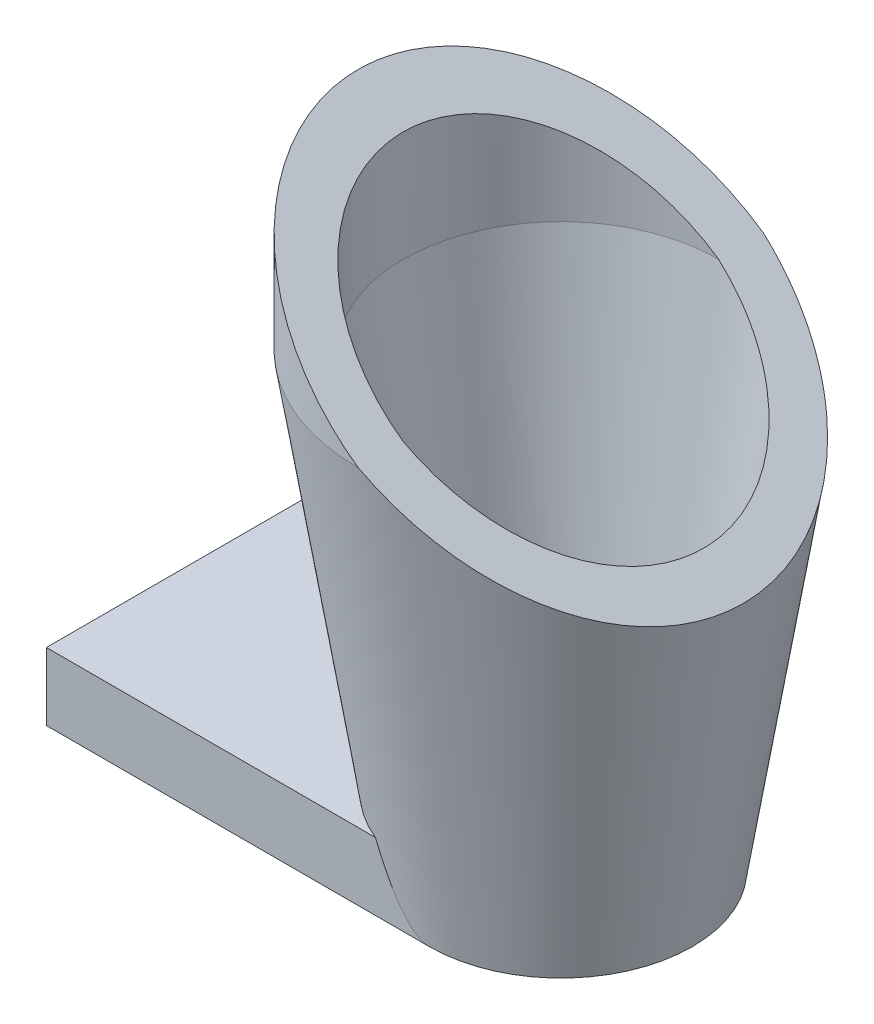
ISO-10303-21;
HEADER;
FILE_DESCRIPTION(('STEP AP214'),'2;1');
FILE_NAME('part.step','',(''),(''),'','','');
FILE_SCHEMA(('AUTOMOTIVE_DESIGN { 1 0 10303 214 1 1 1 1 }'));
ENDSEC;
DATA;
#1=APPLICATION_CONTEXT('core data for automotive mechanical design processes');
#2=APPLICATION_PROTOCOL_DEFINITION('international standard','automotive_design',2000,#1);
#3=PRODUCT_CONTEXT('',#1,'mechanical');
#4=PRODUCT('Part','Part','',(#3));
#5=PRODUCT_RELATED_PRODUCT_CATEGORY('part','',(#4));
#6=PRODUCT_DEFINITION_FORMATION('','',#4);
#7=PRODUCT_DEFINITION_CONTEXT('part definition',#1,'design');
#8=PRODUCT_DEFINITION('design','',#6,#7);
#9=PRODUCT_DEFINITION_SHAPE('','',#8);
#10=(LENGTH_UNIT() NAMED_UNIT(*) SI_UNIT(.MILLI.,.METRE.));
#11=(NAMED_UNIT(*) PLANE_ANGLE_UNIT() SI_UNIT($,.RADIAN.));
#12=(NAMED_UNIT(*) SI_UNIT($,.STERADIAN.) SOLID_ANGLE_UNIT());
#13=UNCERTAINTY_MEASURE_WITH_UNIT(LENGTH_MEASURE(1.E-05),#10,'distance_accuracy_value','');
#14=(GEOMETRIC_REPRESENTATION_CONTEXT(3) GLOBAL_UNCERTAINTY_ASSIGNED_CONTEXT((#13)) GLOBAL_UNIT_ASSIGNED_CONTEXT((#10,
#11,#12)) REPRESENTATION_CONTEXT('',''));
#15=CARTESIAN_POINT('',(0.,0.,0.));
#16=DIRECTION('',(0.,0.,1.));
#17=DIRECTION('',(1.,0.,0.));
#18=AXIS2_PLACEMENT_3D('',#15,#16,#17);
#19=CARTESIAN_POINT('',(0.,0.,0.));
#20=DIRECTION('',(0.573576436351047,0.819152044288991,0.));
#21=DIRECTION('',(-0.819152044288991,0.573576436351047,0.));
#22=AXIS2_PLACEMENT_3D('',#19,#20,#21);
#23=PLANE('',#22);
#24=CARTESIAN_POINT('',(-1.01054677785715,0.707592471569111,0.));
#25=DIRECTION('',(0.573576436351047,0.819152044288991,0.));
#26=DIRECTION('',(-0.819152044288991,0.573576436351047,0.));
#27=AXIS2_PLACEMENT_3D('',#24,#25,#26);
#28=ELLIPSE('',#27,11.1237855061406,9.05586245137844);
#29=CARTESIAN_POINT('',(0.,0.,-9.));
#30=VERTEX_POINT('',#29);
#31=CARTESIAN_POINT('',(0.,0.,9.));
#32=VERTEX_POINT('',#31);
#33=EDGE_CURVE('E50',#30,#32,#28,.F.);
#34=ORIENTED_EDGE('',*,*,#33,.F.);
#35=CARTESIAN_POINT('',(0.,0.,0.));
#36=DIRECTION('',(0.573576436351047,0.819152044288991,0.));
#37=DIRECTION('',(0.819152044288991,-0.573576436351047,0.));
#38=AXIS2_PLACEMENT_3D('',#35,#36,#37);
#39=ELLIPSE('',#38,10.9869712988531,9.);
#40=EDGE_CURVE('E186',#30,#32,#39,.T.);
#41=ORIENTED_EDGE('',*,*,#40,.T.);
#42=EDGE_LOOP('',(#34,#41));
#43=FACE_BOUND('',#42,.T.);
#44=CARTESIAN_POINT('',(-0.74341897005252,0.520547566878874,0.));
#45=DIRECTION('',(0.573576436351047,0.819152044288991,0.));
#46=DIRECTION('',(-0.819152044288991,0.573576436351047,0.));
#47=AXIS2_PLACEMENT_3D('',#44,#45,#46);
#48=ELLIPSE('',#47,8.6407428076133,7.0389327987432);
#49=CARTESIAN_POINT('',(0.,0.,7.));
#50=VERTEX_POINT('',#49);
#51=CARTESIAN_POINT('',(0.,0.,-7.));
#52=VERTEX_POINT('',#51);
#53=EDGE_CURVE('E180',#50,#52,#48,.T.);
#54=ORIENTED_EDGE('',*,*,#53,.F.);
#55=CARTESIAN_POINT('',(0.,0.,0.));
#56=DIRECTION('',(0.573576436351047,0.819152044288991,0.));
#57=DIRECTION('',(0.819152044288991,-0.573576436351047,0.));
#58=AXIS2_PLACEMENT_3D('',#55,#56,#57);
#59=ELLIPSE('',#58,8.5454221213302,7.);
#60=EDGE_CURVE('E171',#50,#52,#59,.F.);
#61=ORIENTED_EDGE('',*,*,#60,.T.);
#62=EDGE_LOOP('',(#54,#61));
#63=FACE_BOUND('',#62,.T.);
#64=ADVANCED_FACE('F42',(#43,#63),#23,.T.);
#65=CARTESIAN_POINT('',(0.,30.,0.));
#66=DIRECTION('',(0.,-1.,0.));
#67=DIRECTION('',(0.,0.,-1.));
#68=AXIS2_PLACEMENT_3D('',#65,#66,#67);
#69=CYLINDRICAL_SURFACE('',#68,9.);
#70=ORIENTED_EDGE('',*,*,#40,.F.);
#71=CARTESIAN_POINT('',(0.,0.,0.));
#72=DIRECTION('',(0.,1.,0.));
#73=DIRECTION('',(0.,0.,1.));
#74=AXIS2_PLACEMENT_3D('',#71,#72,#73);
#75=CIRCLE('',#74,9.);
#76=EDGE_CURVE('E190',#30,#32,#75,.T.);
#77=ORIENTED_EDGE('',*,*,#76,.T.);
#78=EDGE_LOOP('',(#70,#77));
#79=FACE_BOUND('',#78,.T.);
#80=ADVANCED_FACE('F44',(#79),#69,.T.);
#81=CARTESIAN_POINT('',(0.,0.,0.));
#82=DIRECTION('',(0.,1.,0.));
#83=DIRECTION('',(0.,0.,1.));
#84=AXIS2_PLACEMENT_3D('',#81,#82,#83);
#85=CONICAL_SURFACE('',#84,9.,0.15707963267949);
#86=CARTESIAN_POINT('',(5.19434586932446,-7.51296701949486,5.83231119350927));
#87=CARTESIAN_POINT('',(5.12920988199603,-7.78647127982895,5.83231119350927));
#88=CARTESIAN_POINT('',(5.06343410501989,-8.05982282079686,5.83231119350927));
#89=CARTESIAN_POINT('',(4.93043372323485,-8.6061773447744,5.83231119350927));
#90=CARTESIAN_POINT('',(4.86320909694845,-8.87918032255336,5.83231119350927));
#91=CARTESIAN_POINT('',(4.6590633420928,-9.69778061581938,5.83231119350927));
#92=CARTESIAN_POINT('',(4.51971571861351,-10.2427776797327,5.83231119350927));
#93=CARTESIAN_POINT('',(4.23230979586455,-11.3318574299918,5.83231119350927));
#94=CARTESIAN_POINT('',(4.08423164091301,-11.8759348906396,5.83231119350927));
#95=CARTESIAN_POINT('',(3.77679250254619,-12.9608464004582,5.83231119350927));
#96=CARTESIAN_POINT('',(3.61743332847668,-13.5016809547284,5.83231119350927));
#97=CARTESIAN_POINT('',(3.39430202929781,-14.218858707378,5.83231119350927));
#98=CARTESIAN_POINT('',(3.33775425104193,-14.3974506865559,5.83231119350927));
#99=CARTESIAN_POINT('',(3.22256578347137,-14.7539596783538,5.83231119350927));
#100=CARTESIAN_POINT('',(3.16392506355995,-14.931876681064,5.83231119350927));
#101=CARTESIAN_POINT('',(2.98446978337873,-15.4642700706301,5.83231119350927));
#102=CARTESIAN_POINT('',(2.86006951313184,-15.8175599335519,5.83231119350927));
#103=CARTESIAN_POINT('',(2.6304495334737,-16.4319420760984,5.83231119350927));
#104=CARTESIAN_POINT('',(2.52815039584054,-16.6941193415446,5.83231119350927));
#105=CARTESIAN_POINT('',(2.31320872601671,-17.2144072699542,5.83231119350927));
#106=CARTESIAN_POINT('',(2.2005609117001,-17.4725157765312,5.83231119350927));
#107=CARTESIAN_POINT('',(1.97829671895806,-17.9440865220114,5.83231119350927));
#108=CARTESIAN_POINT('',(1.87071561684824,-18.1584854831473,5.83231119350927));
#109=CARTESIAN_POINT('',(1.69751664761931,-18.4735531637749,5.83231119350927));
#110=CARTESIAN_POINT('',(1.63782568356414,-18.577466941714,5.83231119350927));
#111=CARTESIAN_POINT('',(1.51347044509526,-18.7822565053364,5.83231119350927));
#112=CARTESIAN_POINT('',(1.44880803051784,-18.8831334076607,5.83231119350927));
#113=CARTESIAN_POINT('',(1.3094432995376,-19.0858835005155,5.83231119350927));
#114=CARTESIAN_POINT('',(1.23438733053995,-19.1875161602096,5.83231119350927));
#115=CARTESIAN_POINT('',(1.07476989279456,-19.3832604610137,5.83231119350927));
#116=CARTESIAN_POINT('',(0.99021131931211,-19.477374378072,5.83231119350927));
#117=CARTESIAN_POINT('',(0.837140385191678,-19.6246127192372,5.83231119350927));
#118=CARTESIAN_POINT('',(0.772063614285766,-19.6812609285817,5.83231119350927));
#119=CARTESIAN_POINT('',(0.634685293743661,-19.7850978240107,5.83231119350927));
#120=CARTESIAN_POINT('',(0.562399628354826,-19.8323066478007,5.83231119350927));
#121=CARTESIAN_POINT('',(0.434177811989067,-19.8995527315546,5.83231119350927));
#122=CARTESIAN_POINT('',(0.380302420160602,-19.9234612956882,5.83231119350927));
#123=CARTESIAN_POINT('',(0.269424926631262,-19.9623790634055,5.83231119350927));
#124=CARTESIAN_POINT('',(0.212427958741745,-19.9774024264526,5.83231119350927));
#125=CARTESIAN_POINT('',(0.0960666381006544,-19.9968458852791,5.83231119350927));
#126=CARTESIAN_POINT('',(0.0366857474174538,-20.0011705590198,5.83231119350927));
#127=CARTESIAN_POINT('',(-0.0818055205394074,-19.998278482631,5.83231119350927));
#128=CARTESIAN_POINT('',(-0.140915811276729,-19.991058268251,5.83231119350927));
#129=CARTESIAN_POINT('',(-0.250357494400871,-19.9675304347788,5.83231119350927));
#130=CARTESIAN_POINT('',(-0.300935326669671,-19.9523197880275,5.83231119350927));
#131=CARTESIAN_POINT('',(-0.399453626870303,-19.9150402248853,5.83231119350927));
#132=CARTESIAN_POINT('',(-0.447393207148968,-19.8929690166291,5.83231119350927));
#133=CARTESIAN_POINT('',(-0.57828174996616,-19.8232567031038,5.83231119350927));
#134=CARTESIAN_POINT('',(-0.657912585044697,-19.7694383361895,5.83231119350927));
#135=CARTESIAN_POINT('',(-0.808553807466479,-19.650832640402,5.83231119350927));
#136=CARTESIAN_POINT('',(-0.879529090725282,-19.5860030394786,5.83231119350927));
#137=CARTESIAN_POINT('',(-1.04256192316421,-19.4210536634282,5.83231119350927));
#138=CARTESIAN_POINT('',(-1.13108054828879,-19.3174853313675,5.83231119350927));
#139=CARTESIAN_POINT('',(-1.29809802422332,-19.1024612183323,5.83231119350927));
#140=CARTESIAN_POINT('',(-1.37657319799393,-18.9909877280796,5.83231119350927));
#141=CARTESIAN_POINT('',(-1.52645236967372,-18.7624695807171,5.83231119350927));
#142=CARTESIAN_POINT('',(-1.59781085280664,-18.6453953710672,5.83231119350927));
#143=CARTESIAN_POINT('',(-1.73463349509898,-18.4080762362964,5.83231119350927));
#144=CARTESIAN_POINT('',(-1.80010444178487,-18.28783517447,5.83231119350927));
#145=CARTESIAN_POINT('',(-1.93328356873754,-18.0319423172552,5.83231119350927));
#146=CARTESIAN_POINT('',(-2.00047562001362,-17.8960234328597,5.83231119350927));
#147=CARTESIAN_POINT('',(-2.13044004952181,-17.6220802484604,5.83231119350927));
#148=CARTESIAN_POINT('',(-2.19321173762589,-17.4840556237731,5.83231119350927));
#149=CARTESIAN_POINT('',(-2.37625539251654,-17.0674817129787,5.83231119350927));
#150=CARTESIAN_POINT('',(-2.49117884048847,-16.7865859891474,5.83231119350927));
#151=CARTESIAN_POINT('',(-2.71135189076989,-16.2202837703667,5.83231119350927));
#152=CARTESIAN_POINT('',(-2.81657631675924,-15.9348676714349,5.83231119350927));
#153=CARTESIAN_POINT('',(-3.01953013430117,-15.3615018697021,5.83231119350927));
#154=CARTESIAN_POINT('',(-3.11726200034593,-15.0735530386881,5.83231119350927));
#155=CARTESIAN_POINT('',(-3.30696410685768,-14.4957348186245,5.83231119350927));
#156=CARTESIAN_POINT('',(-3.39893360625622,-14.2058651878295,5.83231119350927));
#157=CARTESIAN_POINT('',(-3.57824904793539,-13.6246801864875,5.83231119350927));
#158=CARTESIAN_POINT('',(-3.66559461868936,-13.3333647018185,5.83231119350927));
#159=CARTESIAN_POINT('',(-3.92176808529967,-12.4585379078912,5.83231119350927));
#160=CARTESIAN_POINT('',(-4.08497835802908,-11.8733810418626,5.83231119350927));
#161=CARTESIAN_POINT('',(-4.32737054937651,-10.972968829312,5.83231119350927));
#162=CARTESIAN_POINT('',(-4.41034029088836,-10.6587154710423,5.83231119350927));
#163=CARTESIAN_POINT('',(-4.57368510312026,-10.0294330142763,5.83231119350927));
#164=CARTESIAN_POINT('',(-4.65405939372604,-9.71440371262004,5.83231119350927));
#165=CARTESIAN_POINT('',(-4.81220606411192,-9.08519262629502,5.83231119350927));
#166=CARTESIAN_POINT('',(-4.88998847463864,-8.77101335423387,5.83231119350927));
#167=CARTESIAN_POINT('',(-5.0435752458452,-8.14227776836471,5.83231119350927));
#168=CARTESIAN_POINT('',(-5.11938023060825,-7.82772160710392,5.83231119350927));
#169=CARTESIAN_POINT('',(-5.19434586932446,-7.51296701949486,5.83231119350927));
#170=B_SPLINE_CURVE_WITH_KNOTS('',3,(#86,#87,#88,#89,#90,#91,#92,#93,#94,#95,#96,#97,#98,#99,
#100,#101,#102,#103,#104,#105,#106,#107,#108,#109,#110,#111,#112,#113,#114,#115,#116,#117,#118,
#119,#120,#121,#122,#123,#124,#125,#126,#127,#128,#129,#130,#131,#132,#133,#134,#135,#136,#137,
#138,#139,#140,#141,#142,#143,#144,#145,#146,#147,#148,#149,#150,#151,#152,#153,#154,#155,#156,
#157,#158,#159,#160,#161,#162,#163,#164,#165,#166,#167,#168,#169),.UNSPECIFIED.,.F.,.F.,(4,2,2,
2,2,2,2,2,2,2,2,2,2,2,2,2,2,2,2,2,2,2,2,2,2,2,2,2,2,2,2,2,2,2,2,2,2,2,2,2,2,4),(0.,
0.8434584679724,1.6869294478493,3.3744621133143,5.06599299062163,6.75725317784033,
7.31923313899781,7.88122131911607,9.0046608247589,9.84879540209149,10.6933632584468,
11.4124765188797,11.7718880433731,12.1311657590094,12.5098507622534,12.8884206985039,
13.1467320621161,13.4044863300187,13.5807108060798,13.756653688646,13.9341602448174,
14.1117200750091,14.2695822224676,14.4274971627364,14.7141424518004,15.0019141277174,
15.4095990126537,15.8182279566619,16.2293220624831,16.6399359884974,17.0946920551472,
17.5495189637778,18.4596876729121,19.3721560803414,20.2843218261069,21.1966046410605,
22.1089606458424,23.9312624615067,24.9063224961421,25.8816729269457,26.8526603528826,
27.8233375300438),.UNSPECIFIED.);
#171=CARTESIAN_POINT('',(0.,-20.,5.83231119350927));
#172=VERTEX_POINT('',#171);
#173=CARTESIAN_POINT('',(-2.4017191225302,-17.,5.83231119350927));
#174=VERTEX_POINT('',#173);
#175=EDGE_CURVE('E97',#172,#174,#170,.T.);
#176=ORIENTED_EDGE('',*,*,#175,.F.);
#177=CARTESIAN_POINT('',(0.,-20.,0.));
#178=DIRECTION('',(0.,1.,0.));
#179=DIRECTION('',(0.,0.,1.));
#180=AXIS2_PLACEMENT_3D('',#177,#178,#179);
#181=CIRCLE('',#180,5.83231119350927);
#182=CARTESIAN_POINT('',(0.,-20.,-5.83231119350927));
#183=VERTEX_POINT('',#182);
#184=EDGE_CURVE('E193',#172,#183,#181,.T.);
#185=ORIENTED_EDGE('',*,*,#184,.T.);
#186=CARTESIAN_POINT('',(5.19434586932446,-7.51296701949486,-5.83231119350927));
#187=CARTESIAN_POINT('',(5.12920988199603,-7.78647127982895,-5.83231119350927));
#188=CARTESIAN_POINT('',(5.06343410501989,-8.05982282079685,-5.83231119350927));
#189=CARTESIAN_POINT('',(4.93043372323485,-8.60617734477439,-5.83231119350927));
#190=CARTESIAN_POINT('',(4.86320909694845,-8.87918032255336,-5.83231119350927));
#191=CARTESIAN_POINT('',(4.6590633420928,-9.69778061581937,-5.83231119350927));
#192=CARTESIAN_POINT('',(4.51971571861351,-10.2427776797327,-5.83231119350927));
#193=CARTESIAN_POINT('',(4.23230979586455,-11.3318574299918,-5.83231119350927));
#194=CARTESIAN_POINT('',(4.08423164091301,-11.8759348906396,-5.83231119350927));
#195=CARTESIAN_POINT('',(3.77679250254619,-12.9608464004582,-5.83231119350927));
#196=CARTESIAN_POINT('',(3.61743332847668,-13.5016809547284,-5.83231119350927));
#197=CARTESIAN_POINT('',(3.39430202929781,-14.218858707378,-5.83231119350927));
#198=CARTESIAN_POINT('',(3.33775425104192,-14.3974506865559,-5.83231119350927));
#199=CARTESIAN_POINT('',(3.22256578347137,-14.7539596783538,-5.83231119350927));
#200=CARTESIAN_POINT('',(3.16392506355995,-14.931876681064,-5.83231119350927));
#201=CARTESIAN_POINT('',(2.98446978337873,-15.4642700706301,-5.83231119350927));
#202=CARTESIAN_POINT('',(2.86006951313184,-15.8175599335519,-5.83231119350927));
#203=CARTESIAN_POINT('',(2.63044953347369,-16.4319420760984,-5.83231119350927));
#204=CARTESIAN_POINT('',(2.52815039584053,-16.6941193415446,-5.83231119350927));
#205=CARTESIAN_POINT('',(2.31320872601669,-17.2144072699542,-5.83231119350927));
#206=CARTESIAN_POINT('',(2.20056091170008,-17.4725157765312,-5.83231119350927));
#207=CARTESIAN_POINT('',(1.97829671895803,-17.9440865220114,-5.83231119350927));
#208=CARTESIAN_POINT('',(1.87071561684819,-18.1584854831474,-5.83231119350927));
#209=CARTESIAN_POINT('',(1.69751664761925,-18.4735531637751,-5.83231119350927));
#210=CARTESIAN_POINT('',(1.63782568356407,-18.5774669417141,-5.83231119350927));
#211=CARTESIAN_POINT('',(1.51347044509517,-18.7822565053366,-5.83231119350927));
#212=CARTESIAN_POINT('',(1.44880803051775,-18.8831334076608,-5.83231119350927));
#213=CARTESIAN_POINT('',(1.30944329953751,-19.0858835005157,-5.83231119350927));
#214=CARTESIAN_POINT('',(1.23438733053989,-19.1875161602097,-5.83231119350927));
#215=CARTESIAN_POINT('',(1.07476989279455,-19.3832604610137,-5.83231119350927));
#216=CARTESIAN_POINT('',(0.990211319312122,-19.477374378072,-5.83231119350927));
#217=CARTESIAN_POINT('',(0.837140385191708,-19.6246127192371,-5.83231119350927));
#218=CARTESIAN_POINT('',(0.772063614285782,-19.6812609285817,-5.83231119350927));
#219=CARTESIAN_POINT('',(0.634685293743645,-19.7850978240107,-5.83231119350927));
#220=CARTESIAN_POINT('',(0.562399628354792,-19.8323066478008,-5.83231119350927));
#221=CARTESIAN_POINT('',(0.434177811989017,-19.8995527315547,-5.83231119350927));
#222=CARTESIAN_POINT('',(0.380302420160556,-19.9234612956882,-5.83231119350927));
#223=CARTESIAN_POINT('',(0.269424926631224,-19.9623790634055,-5.83231119350927));
#224=CARTESIAN_POINT('',(0.21242795874171,-19.9774024264526,-5.83231119350927));
#225=CARTESIAN_POINT('',(0.0960666381006271,-19.9968458852791,-5.83231119350927));
#226=CARTESIAN_POINT('',(0.0366857474174307,-20.0011705590198,-5.83231119350927));
#227=CARTESIAN_POINT('',(-0.0818055205394211,-19.998278482631,-5.83231119350927));
#228=CARTESIAN_POINT('',(-0.140915811276737,-19.991058268251,-5.83231119350927));
#229=CARTESIAN_POINT('',(-0.250357494400875,-19.9675304347788,-5.83231119350927));
#230=CARTESIAN_POINT('',(-0.300935326669676,-19.9523197880275,-5.83231119350927));
#231=CARTESIAN_POINT('',(-0.399453626870307,-19.9150402248853,-5.83231119350927));
#232=CARTESIAN_POINT('',(-0.447393207148971,-19.8929690166291,-5.83231119350927));
#233=CARTESIAN_POINT('',(-0.578281749966161,-19.8232567031038,-5.83231119350927));
#234=CARTESIAN_POINT('',(-0.657912585044698,-19.7694383361895,-5.83231119350927));
#235=CARTESIAN_POINT('',(-0.808553807466481,-19.650832640402,-5.83231119350927));
#236=CARTESIAN_POINT('',(-0.879529090725285,-19.5860030394785,-5.83231119350927));
#237=CARTESIAN_POINT('',(-1.04256192316421,-19.4210536634281,-5.83231119350927));
#238=CARTESIAN_POINT('',(-1.1310805482888,-19.3174853313675,-5.83231119350927));
#239=CARTESIAN_POINT('',(-1.29809802422333,-19.1024612183323,-5.83231119350927));
#240=CARTESIAN_POINT('',(-1.37657319799394,-18.9909877280796,-5.83231119350927));
#241=CARTESIAN_POINT('',(-1.52645236967373,-18.7624695807171,-5.83231119350927));
#242=CARTESIAN_POINT('',(-1.59781085280665,-18.6453953710672,-5.83231119350927));
#243=CARTESIAN_POINT('',(-1.73463349509899,-18.4080762362964,-5.83231119350927));
#244=CARTESIAN_POINT('',(-1.80010444178488,-18.28783517447,-5.83231119350927));
#245=CARTESIAN_POINT('',(-1.93328356873755,-18.0319423172552,-5.83231119350927));
#246=CARTESIAN_POINT('',(-2.00047562001363,-17.8960234328596,-5.83231119350927));
#247=CARTESIAN_POINT('',(-2.13044004952182,-17.6220802484604,-5.83231119350927));
#248=CARTESIAN_POINT('',(-2.1932117376259,-17.484055623773,-5.83231119350927));
#249=CARTESIAN_POINT('',(-2.37625539251655,-17.0674817129787,-5.83231119350927));
#250=CARTESIAN_POINT('',(-2.49117884048848,-16.7865859891473,-5.83231119350927));
#251=CARTESIAN_POINT('',(-2.7113518907699,-16.2202837703667,-5.83231119350927));
#252=CARTESIAN_POINT('',(-2.81657631675925,-15.9348676714349,-5.83231119350927));
#253=CARTESIAN_POINT('',(-3.01953013430118,-15.3615018697021,-5.83231119350927));
#254=CARTESIAN_POINT('',(-3.11726200034595,-15.0735530386881,-5.83231119350927));
#255=CARTESIAN_POINT('',(-3.30696410685769,-14.4957348186244,-5.83231119350927));
#256=CARTESIAN_POINT('',(-3.39893360625623,-14.2058651878295,-5.83231119350927));
#257=CARTESIAN_POINT('',(-3.5782490479354,-13.6246801864874,-5.83231119350927));
#258=CARTESIAN_POINT('',(-3.66559461868938,-13.3333647018184,-5.83231119350927));
#259=CARTESIAN_POINT('',(-3.92176808529968,-12.4585379078911,-5.83231119350927));
#260=CARTESIAN_POINT('',(-4.0849783580291,-11.8733810418625,-5.83231119350927));
#261=CARTESIAN_POINT('',(-4.32737054937653,-10.972968829312,-5.83231119350927));
#262=CARTESIAN_POINT('',(-4.41034029088837,-10.6587154710423,-5.83231119350927));
#263=CARTESIAN_POINT('',(-4.57368510312027,-10.0294330142763,-5.83231119350927));
#264=CARTESIAN_POINT('',(-4.65405939372605,-9.71440371262,-5.83231119350927));
#265=CARTESIAN_POINT('',(-4.81220606411192,-9.08519262629499,-5.83231119350927));
#266=CARTESIAN_POINT('',(-4.88998847463864,-8.77101335423385,-5.83231119350927));
#267=CARTESIAN_POINT('',(-5.0435752458452,-8.1422777683647,-5.83231119350927));
#268=CARTESIAN_POINT('',(-5.11938023060826,-7.82772160710392,-5.83231119350927));
#269=CARTESIAN_POINT('',(-5.19434586932446,-7.51296701949486,-5.83231119350927));
#270=B_SPLINE_CURVE_WITH_KNOTS('',3,(#186,#187,#188,#189,#190,#191,#192,#193,#194,#195,#196,
#197,#198,#199,#200,#201,#202,#203,#204,#205,#206,#207,#208,#209,#210,#211,#212,#213,#214,#215,
#216,#217,#218,#219,#220,#221,#222,#223,#224,#225,#226,#227,#228,#229,#230,#231,#232,#233,#234,
#235,#236,#237,#238,#239,#240,#241,#242,#243,#244,#245,#246,#247,#248,#249,#250,#251,#252,#253,
#254,#255,#256,#257,#258,#259,#260,#261,#262,#263,#264,#265,#266,#267,#268,#269),.UNSPECIFIED.,
.F.,.F.,(4,2,2,2,2,2,2,2,2,2,2,2,2,2,2,2,2,2,2,2,2,2,2,2,2,2,2,2,2,2,2,2,2,2,2,2,2,2,2,2,2,4),
(0.,0.8434584679724,1.6869294478493,3.3744621133143,5.06599299062162,6.75725317784033,
7.31923313899781,7.88122131911607,9.00466082475889,9.84879540209152,10.6933632584468,
11.4124765188798,11.7718880433733,12.1311657590096,12.5098507622534,12.8884206985038,
13.1467320621161,13.4044863300187,13.5807108060799,13.756653688646,13.9341602448174,
14.1117200750091,14.2695822224676,14.4274971627364,14.7141424518004,15.0019141277174,
15.4095990126537,15.8182279566619,16.2293220624831,16.6399359884974,17.0946920551472,
17.5495189637778,18.4596876729121,19.3721560803415,20.2843218261069,21.1966046410605,
22.1089606458425,23.9312624615068,24.9063224961422,25.8816729269457,26.8526603528826,
27.8233375300438),.UNSPECIFIED.);
#271=CARTESIAN_POINT('',(-2.40171912253019,-17.,-5.83231119350927));
#272=VERTEX_POINT('',#271);
#273=EDGE_CURVE('E60',#183,#272,#270,.T.);
#274=ORIENTED_EDGE('',*,*,#273,.T.);
#275=CARTESIAN_POINT('',(0.,-17.,0.));
#276=DIRECTION('',(0.,-1.,0.));
#277=DIRECTION('',(0.,0.,-1.));
#278=AXIS2_PLACEMENT_3D('',#275,#276,#277);
#279=CIRCLE('',#278,6.30746451448288);
#280=EDGE_CURVE('E13',#272,#174,#279,.F.);
#281=ORIENTED_EDGE('',*,*,#280,.T.);
#282=EDGE_LOOP('',(#176,#185,#274,#281));
#283=FACE_BOUND('',#282,.T.);
#284=ORIENTED_EDGE('',*,*,#76,.F.);
#285=ORIENTED_EDGE('',*,*,#33,.T.);
#286=EDGE_LOOP('',(#284,#285));
#287=FACE_BOUND('',#286,.T.);
#288=ADVANCED_FACE('F136',(#283,#287),#85,.T.);
#289=CARTESIAN_POINT('',(0.,-20.,0.));
#290=DIRECTION('',(0.,1.,0.));
#291=DIRECTION('',(0.,0.,1.));
#292=AXIS2_PLACEMENT_3D('',#289,#290,#291);
#293=PLANE('',#292);
#294=CARTESIAN_POINT('',(0.,-20.,0.));
#295=DIRECTION('',(0.,-1.,0.));
#296=DIRECTION('',(0.,0.,-1.));
#297=AXIS2_PLACEMENT_3D('',#294,#295,#296);
#298=CIRCLE('',#297,4.);
#299=CARTESIAN_POINT('',(0.,-20.,-4.));
#300=VERTEX_POINT('',#299);
#301=EDGE_CURVE('E170',#300,#300,#298,.T.);
#302=ORIENTED_EDGE('',*,*,#301,.F.);
#303=EDGE_LOOP('',(#302));
#304=FACE_BOUND('',#303,.T.);
#305=ORIENTED_EDGE('',*,*,#184,.F.);
#306=DIRECTION('',(-1.,0.,0.));
#307=VECTOR('',#306,1.);
#308=CARTESIAN_POINT('',(0.,-20.,5.83231119350927));
#309=LINE('',#308,#307);
#310=CARTESIAN_POINT('',(-17.,-20.,5.83231119350927));
#311=VERTEX_POINT('',#310);
#312=EDGE_CURVE('E118',#172,#311,#309,.T.);
#313=ORIENTED_EDGE('',*,*,#312,.T.);
#314=DIRECTION('',(0.,0.,-1.));
#315=VECTOR('',#314,1.);
#316=CARTESIAN_POINT('',(-17.,-20.,0.));
#317=LINE('',#316,#315);
#318=CARTESIAN_POINT('',(-17.,-20.,-5.83231119350927));
#319=VERTEX_POINT('',#318);
#320=EDGE_CURVE('E107',#311,#319,#317,.T.);
#321=ORIENTED_EDGE('',*,*,#320,.T.);
#322=DIRECTION('',(-1.,0.,0.));
#323=VECTOR('',#322,1.);
#324=CARTESIAN_POINT('',(0.,-20.,-5.83231119350927));
#325=LINE('',#324,#323);
#326=EDGE_CURVE('E101',#183,#319,#325,.T.);
#327=ORIENTED_EDGE('',*,*,#326,.F.);
#328=EDGE_LOOP('',(#305,#313,#321,#327));
#329=FACE_BOUND('',#328,.T.);
#330=ADVANCED_FACE('F205',(#304,#329),#293,.F.);
#331=CARTESIAN_POINT('',(0.,-20.,0.));
#332=DIRECTION('',(0.,1.,0.));
#333=DIRECTION('',(0.,0.,1.));
#334=AXIS2_PLACEMENT_3D('',#331,#332,#333);
#335=CONICAL_SURFACE('',#334,4.,0.148889947609497);
#336=ORIENTED_EDGE('',*,*,#53,.T.);
#337=CARTESIAN_POINT('',(0.,0.,0.));
#338=DIRECTION('',(0.,1.,0.));
#339=DIRECTION('',(0.,0.,1.));
#340=AXIS2_PLACEMENT_3D('',#337,#338,#339);
#341=CIRCLE('',#340,7.);
#342=EDGE_CURVE('E162',#52,#50,#341,.T.);
#343=ORIENTED_EDGE('',*,*,#342,.T.);
#344=EDGE_LOOP('',(#336,#343));
#345=FACE_BOUND('',#344,.T.);
#346=ORIENTED_EDGE('',*,*,#301,.T.);
#347=EDGE_LOOP('',(#346));
#348=FACE_BOUND('',#347,.T.);
#349=ADVANCED_FACE('F153',(#345,#348),#335,.F.);
#350=CARTESIAN_POINT('',(0.,4.99999999999998,0.));
#351=DIRECTION('',(0.,-1.,0.));
#352=DIRECTION('',(0.,0.,-1.));
#353=AXIS2_PLACEMENT_3D('',#350,#351,#352);
#354=CYLINDRICAL_SURFACE('',#353,7.);
#355=ORIENTED_EDGE('',*,*,#342,.F.);
#356=ORIENTED_EDGE('',*,*,#60,.F.);
#357=EDGE_LOOP('',(#355,#356));
#358=FACE_BOUND('',#357,.T.);
#359=ADVANCED_FACE('F149',(#358),#354,.F.);
#360=CARTESIAN_POINT('',(0.,-17.,5.83231119350927));
#361=DIRECTION('',(0.,0.,1.));
#362=DIRECTION('',(1.,0.,0.));
#363=AXIS2_PLACEMENT_3D('',#360,#361,#362);
#364=PLANE('',#363);
#365=ORIENTED_EDGE('',*,*,#312,.F.);
#366=ORIENTED_EDGE('',*,*,#175,.T.);
#367=DIRECTION('',(-1.,0.,0.));
#368=VECTOR('',#367,1.);
#369=CARTESIAN_POINT('',(0.,-17.,5.83231119350927));
#370=LINE('',#369,#368);
#371=CARTESIAN_POINT('',(-17.,-17.,5.83231119350927));
#372=VERTEX_POINT('',#371);
#373=EDGE_CURVE('E91',#174,#372,#370,.T.);
#374=ORIENTED_EDGE('',*,*,#373,.T.);
#375=DIRECTION('',(0.,-1.,0.));
#376=VECTOR('',#375,1.);
#377=CARTESIAN_POINT('',(-17.,-17.,5.83231119350927));
#378=LINE('',#377,#376);
#379=EDGE_CURVE('E95',#372,#311,#378,.T.);
#380=ORIENTED_EDGE('',*,*,#379,.T.);
#381=EDGE_LOOP('',(#365,#366,#374,#380));
#382=FACE_BOUND('',#381,.T.);
#383=ADVANCED_FACE('F94',(#382),#364,.T.);
#384=CARTESIAN_POINT('',(0.,-17.,-5.83231119350927));
#385=DIRECTION('',(0.,0.,1.));
#386=DIRECTION('',(1.,0.,0.));
#387=AXIS2_PLACEMENT_3D('',#384,#385,#386);
#388=PLANE('',#387);
#389=ORIENTED_EDGE('',*,*,#273,.F.);
#390=ORIENTED_EDGE('',*,*,#326,.T.);
#391=DIRECTION('',(0.,-1.,0.));
#392=VECTOR('',#391,1.);
#393=CARTESIAN_POINT('',(-17.,-17.,-5.83231119350927));
#394=LINE('',#393,#392);
#395=CARTESIAN_POINT('',(-17.,-17.,-5.83231119350927));
#396=VERTEX_POINT('',#395);
#397=EDGE_CURVE('E109',#396,#319,#394,.T.);
#398=ORIENTED_EDGE('',*,*,#397,.F.);
#399=DIRECTION('',(-1.,0.,0.));
#400=VECTOR('',#399,1.);
#401=CARTESIAN_POINT('',(0.,-17.,-5.83231119350927));
#402=LINE('',#401,#400);
#403=EDGE_CURVE('E110',#272,#396,#402,.T.);
#404=ORIENTED_EDGE('',*,*,#403,.F.);
#405=EDGE_LOOP('',(#389,#390,#398,#404));
#406=FACE_BOUND('',#405,.T.);
#407=ADVANCED_FACE('F139',(#406),#388,.F.);
#408=CARTESIAN_POINT('',(-17.,-17.,0.));
#409=DIRECTION('',(-1.,0.,0.));
#410=DIRECTION('',(0.,0.,1.));
#411=AXIS2_PLACEMENT_3D('',#408,#409,#410);
#412=PLANE('',#411);
#413=ORIENTED_EDGE('',*,*,#320,.F.);
#414=ORIENTED_EDGE('',*,*,#379,.F.);
#415=DIRECTION('',(0.,0.,-1.));
#416=VECTOR('',#415,1.);
#417=CARTESIAN_POINT('',(-17.,-17.,0.));
#418=LINE('',#417,#416);
#419=EDGE_CURVE('E100',#372,#396,#418,.T.);
#420=ORIENTED_EDGE('',*,*,#419,.T.);
#421=ORIENTED_EDGE('',*,*,#397,.T.);
#422=EDGE_LOOP('',(#413,#414,#420,#421));
#423=FACE_BOUND('',#422,.T.);
#424=ADVANCED_FACE('F105',(#423),#412,.T.);
#425=CARTESIAN_POINT('',(0.,-17.,0.));
#426=DIRECTION('',(0.,-1.,0.));
#427=DIRECTION('',(0.,0.,-1.));
#428=AXIS2_PLACEMENT_3D('',#425,#426,#427);
#429=PLANE('',#428);
#430=ORIENTED_EDGE('',*,*,#280,.F.);
#431=ORIENTED_EDGE('',*,*,#403,.T.);
#432=ORIENTED_EDGE('',*,*,#419,.F.);
#433=ORIENTED_EDGE('',*,*,#373,.F.);
#434=EDGE_LOOP('',(#430,#431,#432,#433));
#435=FACE_BOUND('',#434,.T.);
#436=ADVANCED_FACE('F112',(#435),#429,.F.);
#437=CLOSED_SHELL('',(#64,#80,#288,#330,#349,#359,#383,#407,#424,#436));
#438=MANIFOLD_SOLID_BREP('B2',#437);
#439=ADVANCED_BREP_SHAPE_REPRESENTATION('',(#18,#438),#14);
#440=SHAPE_DEFINITION_REPRESENTATION(#9,#439);
ENDSEC;
END-ISO-10303-21;
